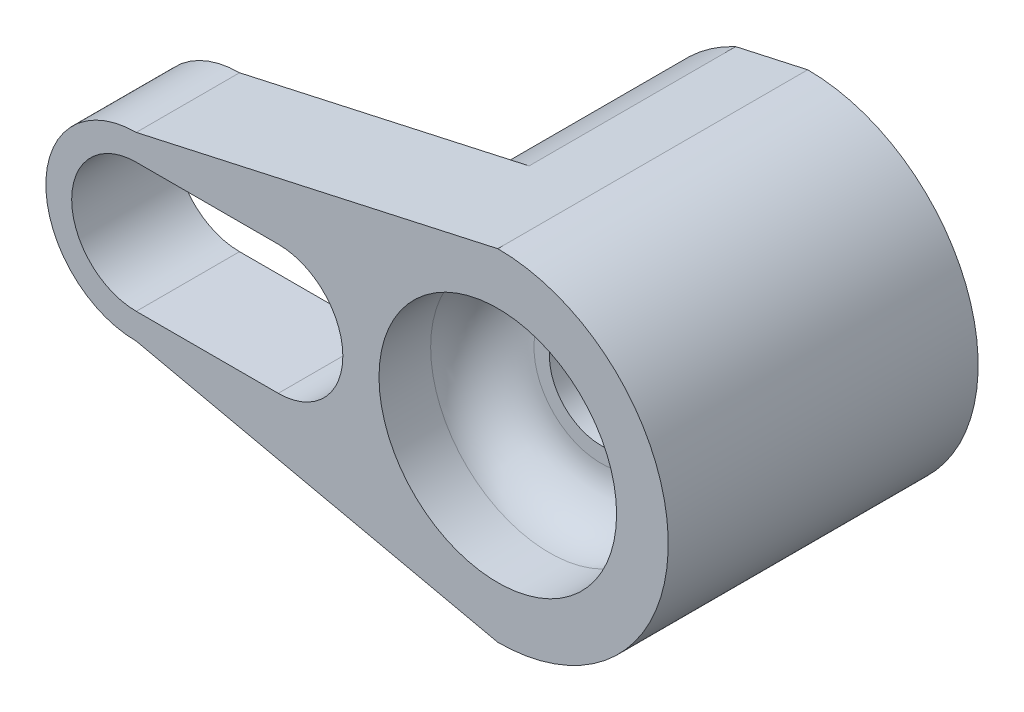
ISO-10303-21;
HEADER;
FILE_DESCRIPTION(('STEP AP214'),'2;1');
FILE_NAME('part.step','',(''),(''),'','','');
FILE_SCHEMA(('AUTOMOTIVE_DESIGN { 1 0 10303 214 1 1 1 1 }'));
ENDSEC;
DATA;
#1=APPLICATION_CONTEXT('core data for automotive mechanical design processes');
#2=APPLICATION_PROTOCOL_DEFINITION('international standard','automotive_design',2000,#1);
#3=PRODUCT_CONTEXT('',#1,'mechanical');
#4=PRODUCT('Part','Part','',(#3));
#5=PRODUCT_RELATED_PRODUCT_CATEGORY('part','',(#4));
#6=PRODUCT_DEFINITION_FORMATION('','',#4);
#7=PRODUCT_DEFINITION_CONTEXT('part definition',#1,'design');
#8=PRODUCT_DEFINITION('design','',#6,#7);
#9=PRODUCT_DEFINITION_SHAPE('','',#8);
#10=(LENGTH_UNIT() NAMED_UNIT(*) SI_UNIT(.MILLI.,.METRE.));
#11=(NAMED_UNIT(*) PLANE_ANGLE_UNIT() SI_UNIT($,.RADIAN.));
#12=(NAMED_UNIT(*) SI_UNIT($,.STERADIAN.) SOLID_ANGLE_UNIT());
#13=UNCERTAINTY_MEASURE_WITH_UNIT(LENGTH_MEASURE(1.E-05),#10,'distance_accuracy_value','');
#14=(GEOMETRIC_REPRESENTATION_CONTEXT(3) GLOBAL_UNCERTAINTY_ASSIGNED_CONTEXT((#13)) GLOBAL_UNIT_ASSIGNED_CONTEXT((#10,
#11,#12)) REPRESENTATION_CONTEXT('',''));
#15=CARTESIAN_POINT('',(0.,0.,0.));
#16=DIRECTION('',(0.,0.,1.));
#17=DIRECTION('',(1.,0.,0.));
#18=AXIS2_PLACEMENT_3D('',#15,#16,#17);
#19=CARTESIAN_POINT('',(0.,0.,2.));
#20=DIRECTION('',(0.,0.,-1.));
#21=DIRECTION('',(-1.,0.,0.));
#22=AXIS2_PLACEMENT_3D('',#19,#20,#21);
#23=CYLINDRICAL_SURFACE('',#22,2.3);
#24=CARTESIAN_POINT('',(0.,0.,-4.));
#25=DIRECTION('',(0.,0.,1.));
#26=DIRECTION('',(1.,0.,0.));
#27=AXIS2_PLACEMENT_3D('',#24,#25,#26);
#28=CIRCLE('',#27,2.3);
#29=CARTESIAN_POINT('',(2.3,0.,-4.));
#30=VERTEX_POINT('',#29);
#31=EDGE_CURVE('E212',#30,#30,#28,.T.);
#32=ORIENTED_EDGE('',*,*,#31,.F.);
#33=EDGE_LOOP('',(#32));
#34=FACE_BOUND('',#33,.T.);
#35=CARTESIAN_POINT('',(0.,0.,-2.));
#36=DIRECTION('',(0.,0.,1.));
#37=DIRECTION('',(1.,0.,0.));
#38=AXIS2_PLACEMENT_3D('',#35,#36,#37);
#39=CIRCLE('',#38,2.3);
#40=CARTESIAN_POINT('',(2.3,0.,-2.));
#41=VERTEX_POINT('',#40);
#42=EDGE_CURVE('E219',#41,#41,#39,.T.);
#43=ORIENTED_EDGE('',*,*,#42,.T.);
#44=EDGE_LOOP('',(#43));
#45=FACE_BOUND('',#44,.T.);
#46=ADVANCED_FACE('F35',(#34,#45),#23,.F.);
#47=CARTESIAN_POINT('',(0.,0.,2.));
#48=DIRECTION('',(0.,0.,-1.));
#49=DIRECTION('',(-1.,0.,0.));
#50=AXIS2_PLACEMENT_3D('',#47,#48,#49);
#51=CYLINDRICAL_SURFACE('',#50,3.3);
#52=DIRECTION('',(0.,0.,-1.));
#53=VECTOR('',#52,1.);
#54=CARTESIAN_POINT('',(0.,-3.3,2.));
#55=LINE('',#54,#53);
#56=CARTESIAN_POINT('',(0.,-3.3,2.));
#57=VERTEX_POINT('',#56);
#58=CARTESIAN_POINT('',(0.,-3.3,-4.));
#59=VERTEX_POINT('',#58);
#60=EDGE_CURVE('E156',#57,#59,#55,.T.);
#61=ORIENTED_EDGE('',*,*,#60,.T.);
#62=CARTESIAN_POINT('',(0.,0.,-4.));
#63=DIRECTION('',(0.,0.,1.));
#64=DIRECTION('',(1.,0.,0.));
#65=AXIS2_PLACEMENT_3D('',#62,#63,#64);
#66=CIRCLE('',#65,3.3);
#67=CARTESIAN_POINT('',(0.,3.3,-4.));
#68=VERTEX_POINT('',#67);
#69=EDGE_CURVE('E274',#59,#68,#66,.T.);
#70=ORIENTED_EDGE('',*,*,#69,.T.);
#71=DIRECTION('',(0.,0.,-1.));
#72=VECTOR('',#71,1.);
#73=CARTESIAN_POINT('',(0.,3.3,2.));
#74=LINE('',#73,#72);
#75=CARTESIAN_POINT('',(0.,3.3,2.));
#76=VERTEX_POINT('',#75);
#77=EDGE_CURVE('E122',#76,#68,#74,.T.);
#78=ORIENTED_EDGE('',*,*,#77,.F.);
#79=CARTESIAN_POINT('',(0.,0.,2.));
#80=DIRECTION('',(0.,0.,1.));
#81=DIRECTION('',(1.,0.,0.));
#82=AXIS2_PLACEMENT_3D('',#79,#80,#81);
#83=CIRCLE('',#82,3.3);
#84=EDGE_CURVE('E131',#57,#76,#83,.T.);
#85=ORIENTED_EDGE('',*,*,#84,.F.);
#86=EDGE_LOOP('',(#61,#70,#78,#85));
#87=FACE_BOUND('',#86,.T.);
#88=ADVANCED_FACE('F273',(#87),#51,.T.);
#89=CARTESIAN_POINT('',(-0.696561451291279,3.14576139292836,2.));
#90=DIRECTION('',(-0.216191979129409,0.976350873487656,0.));
#91=DIRECTION('',(-0.976350873487656,-0.216191979129409,0.));
#92=AXIS2_PLACEMENT_3D('',#89,#90,#91);
#93=PLANE('',#92);
#94=DIRECTION('',(0.976350873487656,0.216191979129409,0.));
#95=VECTOR('',#94,1.);
#96=CARTESIAN_POINT('',(-0.696561451291279,3.14576139292836,0.));
#97=LINE('',#96,#95);
#98=CARTESIAN_POINT('',(-7.,1.75,0.));
#99=VERTEX_POINT('',#98);
#100=CARTESIAN_POINT('',(-1.39312290258256,2.99152278585672,0.));
#101=VERTEX_POINT('',#100);
#102=EDGE_CURVE('E121',#99,#101,#97,.T.);
#103=ORIENTED_EDGE('',*,*,#102,.F.);
#104=DIRECTION('',(0.,0.,-1.));
#105=VECTOR('',#104,1.);
#106=CARTESIAN_POINT('',(-7.,1.75,2.));
#107=LINE('',#106,#105);
#108=CARTESIAN_POINT('',(-7.,1.75,2.));
#109=VERTEX_POINT('',#108);
#110=EDGE_CURVE('E113',#109,#99,#107,.T.);
#111=ORIENTED_EDGE('',*,*,#110,.F.);
#112=DIRECTION('',(0.976350873487656,0.216191979129409,0.));
#113=VECTOR('',#112,1.);
#114=CARTESIAN_POINT('',(-0.696561451291279,3.14576139292836,2.));
#115=LINE('',#114,#113);
#116=EDGE_CURVE('E118',#109,#76,#115,.T.);
#117=ORIENTED_EDGE('',*,*,#116,.T.);
#118=ORIENTED_EDGE('',*,*,#77,.T.);
#119=DIRECTION('',(0.976350873487656,0.216191979129409,0.));
#120=VECTOR('',#119,1.);
#121=CARTESIAN_POINT('',(-0.696561451291279,3.14576139292836,-4.));
#122=LINE('',#121,#120);
#123=CARTESIAN_POINT('',(-1.39312290258256,2.99152278585672,-4.));
#124=VERTEX_POINT('',#123);
#125=EDGE_CURVE('E254',#124,#68,#122,.T.);
#126=ORIENTED_EDGE('',*,*,#125,.F.);
#127=DIRECTION('',(0.,0.,1.));
#128=VECTOR('',#127,1.);
#129=CARTESIAN_POINT('',(-1.39312290258256,2.99152278585672,-4.));
#130=LINE('',#129,#128);
#131=EDGE_CURVE('E244',#124,#101,#130,.T.);
#132=ORIENTED_EDGE('',*,*,#131,.T.);
#133=EDGE_LOOP('',(#103,#111,#117,#118,#126,#132));
#134=FACE_BOUND('',#133,.T.);
#135=ADVANCED_FACE('F115',(#134),#93,.T.);
#136=CARTESIAN_POINT('',(-7.,0.,2.));
#137=DIRECTION('',(0.,0.,-1.));
#138=DIRECTION('',(-1.,0.,0.));
#139=AXIS2_PLACEMENT_3D('',#136,#137,#138);
#140=CYLINDRICAL_SURFACE('',#139,1.75);
#141=CARTESIAN_POINT('',(-7.,0.,0.));
#142=DIRECTION('',(0.,0.,1.));
#143=DIRECTION('',(1.,0.,0.));
#144=AXIS2_PLACEMENT_3D('',#141,#142,#143);
#145=CIRCLE('',#144,1.75);
#146=CARTESIAN_POINT('',(-7.,-1.75,0.));
#147=VERTEX_POINT('',#146);
#148=EDGE_CURVE('E86',#99,#147,#145,.T.);
#149=ORIENTED_EDGE('',*,*,#148,.T.);
#150=DIRECTION('',(0.,0.,-1.));
#151=VECTOR('',#150,1.);
#152=CARTESIAN_POINT('',(-7.,-1.75,2.));
#153=LINE('',#152,#151);
#154=CARTESIAN_POINT('',(-7.,-1.75,2.));
#155=VERTEX_POINT('',#154);
#156=EDGE_CURVE('E123',#155,#147,#153,.T.);
#157=ORIENTED_EDGE('',*,*,#156,.F.);
#158=CARTESIAN_POINT('',(-7.,0.,2.));
#159=DIRECTION('',(0.,0.,1.));
#160=DIRECTION('',(1.,0.,0.));
#161=AXIS2_PLACEMENT_3D('',#158,#159,#160);
#162=CIRCLE('',#161,1.75);
#163=EDGE_CURVE('E125',#109,#155,#162,.T.);
#164=ORIENTED_EDGE('',*,*,#163,.F.);
#165=ORIENTED_EDGE('',*,*,#110,.T.);
#166=EDGE_LOOP('',(#149,#157,#164,#165));
#167=FACE_BOUND('',#166,.T.);
#168=ADVANCED_FACE('F126',(#167),#140,.T.);
#169=CARTESIAN_POINT('',(-4.25,0.,2.));
#170=DIRECTION('',(0.,0.,-1.));
#171=DIRECTION('',(-1.,0.,0.));
#172=AXIS2_PLACEMENT_3D('',#169,#170,#171);
#173=CYLINDRICAL_SURFACE('',#172,1.25);
#174=CARTESIAN_POINT('',(-4.25,0.,0.));
#175=DIRECTION('',(0.,0.,1.));
#176=DIRECTION('',(1.,0.,0.));
#177=AXIS2_PLACEMENT_3D('',#174,#175,#176);
#178=CIRCLE('',#177,1.25);
#179=CARTESIAN_POINT('',(-4.25,-1.25,0.));
#180=VERTEX_POINT('',#179);
#181=CARTESIAN_POINT('',(-3.22235294117647,-0.711647049099023,0.));
#182=VERTEX_POINT('',#181);
#183=EDGE_CURVE('E152',#180,#182,#178,.T.);
#184=ORIENTED_EDGE('',*,*,#183,.F.);
#185=DIRECTION('',(0.,0.,-1.));
#186=VECTOR('',#185,1.);
#187=CARTESIAN_POINT('',(-4.25,-1.25,2.));
#188=LINE('',#187,#186);
#189=CARTESIAN_POINT('',(-4.25,-1.25,2.));
#190=VERTEX_POINT('',#189);
#191=EDGE_CURVE('E94',#190,#180,#188,.T.);
#192=ORIENTED_EDGE('',*,*,#191,.F.);
#193=CARTESIAN_POINT('',(-4.25,0.,2.));
#194=DIRECTION('',(0.,0.,1.));
#195=DIRECTION('',(1.,0.,0.));
#196=AXIS2_PLACEMENT_3D('',#193,#194,#195);
#197=CIRCLE('',#196,1.25);
#198=CARTESIAN_POINT('',(-4.25,1.25,2.));
#199=VERTEX_POINT('',#198);
#200=EDGE_CURVE('E173',#190,#199,#197,.T.);
#201=ORIENTED_EDGE('',*,*,#200,.T.);
#202=DIRECTION('',(0.,0.,-1.));
#203=VECTOR('',#202,1.);
#204=CARTESIAN_POINT('',(-4.25,1.25,2.));
#205=LINE('',#204,#203);
#206=CARTESIAN_POINT('',(-4.25,1.25,0.));
#207=VERTEX_POINT('',#206);
#208=EDGE_CURVE('E142',#199,#207,#205,.T.);
#209=ORIENTED_EDGE('',*,*,#208,.T.);
#210=CARTESIAN_POINT('',(-3.22235294117647,0.711647049099025,0.));
#211=VERTEX_POINT('',#210);
#212=EDGE_CURVE('E149',#211,#207,#178,.T.);
#213=ORIENTED_EDGE('',*,*,#212,.F.);
#214=DIRECTION('',(0.,0.,1.));
#215=VECTOR('',#214,1.);
#216=CARTESIAN_POINT('',(-3.22235294117647,0.711647049099022,-4.));
#217=LINE('',#216,#215);
#218=CARTESIAN_POINT('',(-3.22235294117647,0.711647049099022,-4.));
#219=VERTEX_POINT('',#218);
#220=EDGE_CURVE('E50',#219,#211,#217,.T.);
#221=ORIENTED_EDGE('',*,*,#220,.F.);
#222=CARTESIAN_POINT('',(-4.25,0.,-4.));
#223=DIRECTION('',(0.,0.,1.));
#224=DIRECTION('',(1.,0.,0.));
#225=AXIS2_PLACEMENT_3D('',#222,#223,#224);
#226=CIRCLE('',#225,1.25);
#227=CARTESIAN_POINT('',(-3.22235294117647,-0.711647049099023,-4.));
#228=VERTEX_POINT('',#227);
#229=EDGE_CURVE('E205',#228,#219,#226,.T.);
#230=ORIENTED_EDGE('',*,*,#229,.F.);
#231=DIRECTION('',(0.,0.,1.));
#232=VECTOR('',#231,1.);
#233=CARTESIAN_POINT('',(-3.22235294117647,-0.711647049099023,-4.));
#234=LINE('',#233,#232);
#235=EDGE_CURVE('E201',#228,#182,#234,.T.);
#236=ORIENTED_EDGE('',*,*,#235,.T.);
#237=EDGE_LOOP('',(#184,#192,#201,#209,#213,#221,#230,#236));
#238=FACE_BOUND('',#237,.T.);
#239=ADVANCED_FACE('F198',(#238),#173,.F.);
#240=CARTESIAN_POINT('',(0.,-1.25,2.));
#241=DIRECTION('',(0.,1.,0.));
#242=DIRECTION('',(-1.,0.,0.));
#243=AXIS2_PLACEMENT_3D('',#240,#241,#242);
#244=PLANE('',#243);
#245=DIRECTION('',(1.,0.,0.));
#246=VECTOR('',#245,1.);
#247=CARTESIAN_POINT('',(0.,-1.25,0.));
#248=LINE('',#247,#246);
#249=CARTESIAN_POINT('',(-7.,-1.25,0.));
#250=VERTEX_POINT('',#249);
#251=EDGE_CURVE('E145',#250,#180,#248,.T.);
#252=ORIENTED_EDGE('',*,*,#251,.F.);
#253=DIRECTION('',(0.,0.,-1.));
#254=VECTOR('',#253,1.);
#255=CARTESIAN_POINT('',(-7.,-1.25,2.));
#256=LINE('',#255,#254);
#257=CARTESIAN_POINT('',(-7.,-1.25,2.));
#258=VERTEX_POINT('',#257);
#259=EDGE_CURVE('E157',#258,#250,#256,.T.);
#260=ORIENTED_EDGE('',*,*,#259,.F.);
#261=DIRECTION('',(1.,0.,0.));
#262=VECTOR('',#261,1.);
#263=CARTESIAN_POINT('',(0.,-1.25,2.));
#264=LINE('',#263,#262);
#265=EDGE_CURVE('E196',#258,#190,#264,.T.);
#266=ORIENTED_EDGE('',*,*,#265,.T.);
#267=ORIENTED_EDGE('',*,*,#191,.T.);
#268=EDGE_LOOP('',(#252,#260,#266,#267));
#269=FACE_BOUND('',#268,.T.);
#270=ADVANCED_FACE('F193',(#269),#244,.T.);
#271=CARTESIAN_POINT('',(-7.,0.,2.));
#272=DIRECTION('',(0.,0.,-1.));
#273=DIRECTION('',(-1.,0.,0.));
#274=AXIS2_PLACEMENT_3D('',#271,#272,#273);
#275=CYLINDRICAL_SURFACE('',#274,1.25);
#276=CARTESIAN_POINT('',(-7.,0.,0.));
#277=DIRECTION('',(0.,0.,1.));
#278=DIRECTION('',(1.,0.,0.));
#279=AXIS2_PLACEMENT_3D('',#276,#277,#278);
#280=CIRCLE('',#279,1.25);
#281=CARTESIAN_POINT('',(-7.,1.25,0.));
#282=VERTEX_POINT('',#281);
#283=EDGE_CURVE('E182',#282,#250,#280,.T.);
#284=ORIENTED_EDGE('',*,*,#283,.F.);
#285=DIRECTION('',(0.,0.,-1.));
#286=VECTOR('',#285,1.);
#287=CARTESIAN_POINT('',(-7.,1.25,2.));
#288=LINE('',#287,#286);
#289=CARTESIAN_POINT('',(-7.,1.25,2.));
#290=VERTEX_POINT('',#289);
#291=EDGE_CURVE('E159',#290,#282,#288,.T.);
#292=ORIENTED_EDGE('',*,*,#291,.F.);
#293=CARTESIAN_POINT('',(-7.,0.,2.));
#294=DIRECTION('',(0.,0.,1.));
#295=DIRECTION('',(1.,0.,0.));
#296=AXIS2_PLACEMENT_3D('',#293,#294,#295);
#297=CIRCLE('',#296,1.25);
#298=EDGE_CURVE('E235',#290,#258,#297,.T.);
#299=ORIENTED_EDGE('',*,*,#298,.T.);
#300=ORIENTED_EDGE('',*,*,#259,.T.);
#301=EDGE_LOOP('',(#284,#292,#299,#300));
#302=FACE_BOUND('',#301,.T.);
#303=ADVANCED_FACE('F321',(#302),#275,.F.);
#304=CARTESIAN_POINT('',(-0.696561451291279,-3.14576139292836,2.));
#305=DIRECTION('',(0.216191979129409,0.976350873487656,0.));
#306=DIRECTION('',(-0.976350873487656,0.216191979129409,0.));
#307=AXIS2_PLACEMENT_3D('',#304,#305,#306);
#308=PLANE('',#307);
#309=DIRECTION('',(0.976350873487656,-0.216191979129409,0.));
#310=VECTOR('',#309,1.);
#311=CARTESIAN_POINT('',(-0.696561451291279,-3.14576139292836,0.));
#312=LINE('',#311,#310);
#313=CARTESIAN_POINT('',(-1.39312290258256,-2.99152278585672,0.));
#314=VERTEX_POINT('',#313);
#315=EDGE_CURVE('E170',#147,#314,#312,.T.);
#316=ORIENTED_EDGE('',*,*,#315,.T.);
#317=DIRECTION('',(0.,0.,1.));
#318=VECTOR('',#317,1.);
#319=CARTESIAN_POINT('',(-1.39312290258256,-2.99152278585672,-4.));
#320=LINE('',#319,#318);
#321=CARTESIAN_POINT('',(-1.39312290258256,-2.99152278585672,-4.));
#322=VERTEX_POINT('',#321);
#323=EDGE_CURVE('E211',#322,#314,#320,.T.);
#324=ORIENTED_EDGE('',*,*,#323,.F.);
#325=DIRECTION('',(0.976350873487656,-0.216191979129409,0.));
#326=VECTOR('',#325,1.);
#327=CARTESIAN_POINT('',(-0.696561451291279,-3.14576139292836,-4.));
#328=LINE('',#327,#326);
#329=EDGE_CURVE('E278',#322,#59,#328,.T.);
#330=ORIENTED_EDGE('',*,*,#329,.T.);
#331=ORIENTED_EDGE('',*,*,#60,.F.);
#332=DIRECTION('',(0.976350873487656,-0.216191979129409,0.));
#333=VECTOR('',#332,1.);
#334=CARTESIAN_POINT('',(-0.696561451291279,-3.14576139292836,2.));
#335=LINE('',#334,#333);
#336=EDGE_CURVE('E59',#155,#57,#335,.T.);
#337=ORIENTED_EDGE('',*,*,#336,.F.);
#338=ORIENTED_EDGE('',*,*,#156,.T.);
#339=EDGE_LOOP('',(#316,#324,#330,#331,#337,#338));
#340=FACE_BOUND('',#339,.T.);
#341=ADVANCED_FACE('F258',(#340),#308,.F.);
#342=CARTESIAN_POINT('',(0.,1.25,2.));
#343=DIRECTION('',(0.,1.,0.));
#344=DIRECTION('',(-1.,0.,0.));
#345=AXIS2_PLACEMENT_3D('',#342,#343,#344);
#346=PLANE('',#345);
#347=DIRECTION('',(1.,0.,0.));
#348=VECTOR('',#347,1.);
#349=CARTESIAN_POINT('',(0.,1.25,0.));
#350=LINE('',#349,#348);
#351=EDGE_CURVE('E175',#282,#207,#350,.T.);
#352=ORIENTED_EDGE('',*,*,#351,.T.);
#353=ORIENTED_EDGE('',*,*,#208,.F.);
#354=DIRECTION('',(1.,0.,0.));
#355=VECTOR('',#354,1.);
#356=CARTESIAN_POINT('',(0.,1.25,2.));
#357=LINE('',#356,#355);
#358=EDGE_CURVE('E134',#290,#199,#357,.T.);
#359=ORIENTED_EDGE('',*,*,#358,.F.);
#360=ORIENTED_EDGE('',*,*,#291,.T.);
#361=EDGE_LOOP('',(#352,#353,#359,#360));
#362=FACE_BOUND('',#361,.T.);
#363=ADVANCED_FACE('F242',(#362),#346,.F.);
#364=CARTESIAN_POINT('',(0.,0.,1.));
#365=DIRECTION('',(0.,0.,1.));
#366=DIRECTION('',(1.,0.,0.));
#367=AXIS2_PLACEMENT_3D('',#364,#365,#366);
#368=CIRCLE('',#367,2.3);
#369=CARTESIAN_POINT('',(2.3,0.,1.));
#370=VERTEX_POINT('',#369);
#371=EDGE_CURVE('E11',#370,#370,#368,.F.);
#372=ORIENTED_EDGE('',*,*,#371,.T.);
#373=EDGE_LOOP('',(#372));
#374=FACE_BOUND('',#373,.T.);
#375=CARTESIAN_POINT('',(0.,0.,2.));
#376=DIRECTION('',(0.,0.,1.));
#377=DIRECTION('',(1.,0.,0.));
#378=AXIS2_PLACEMENT_3D('',#375,#376,#377);
#379=CIRCLE('',#378,2.3);
#380=CARTESIAN_POINT('',(2.3,0.,2.));
#381=VERTEX_POINT('',#380);
#382=EDGE_CURVE('E139',#381,#381,#379,.T.);
#383=ORIENTED_EDGE('',*,*,#382,.T.);
#384=EDGE_LOOP('',(#383));
#385=FACE_BOUND('',#384,.T.);
#386=ADVANCED_FACE('F290',(#374,#385),#23,.F.);
#387=CARTESIAN_POINT('',(0.,0.,2.));
#388=DIRECTION('',(0.,0.,1.));
#389=DIRECTION('',(1.,0.,0.));
#390=AXIS2_PLACEMENT_3D('',#387,#388,#389);
#391=PLANE('',#390);
#392=ORIENTED_EDGE('',*,*,#200,.F.);
#393=ORIENTED_EDGE('',*,*,#265,.F.);
#394=ORIENTED_EDGE('',*,*,#298,.F.);
#395=ORIENTED_EDGE('',*,*,#358,.T.);
#396=EDGE_LOOP('',(#392,#393,#394,#395));
#397=FACE_BOUND('',#396,.T.);
#398=ORIENTED_EDGE('',*,*,#84,.T.);
#399=ORIENTED_EDGE('',*,*,#116,.F.);
#400=ORIENTED_EDGE('',*,*,#163,.T.);
#401=ORIENTED_EDGE('',*,*,#336,.T.);
#402=EDGE_LOOP('',(#398,#399,#400,#401));
#403=FACE_BOUND('',#402,.T.);
#404=ORIENTED_EDGE('',*,*,#382,.F.);
#405=EDGE_LOOP('',(#404));
#406=FACE_BOUND('',#405,.T.);
#407=ADVANCED_FACE('F128',(#397,#403,#406),#391,.T.);
#408=CARTESIAN_POINT('',(0.,0.,0.));
#409=DIRECTION('',(0.,0.,1.));
#410=DIRECTION('',(1.,0.,0.));
#411=AXIS2_PLACEMENT_3D('',#408,#409,#410);
#412=PLANE('',#411);
#413=ORIENTED_EDGE('',*,*,#183,.T.);
#414=CARTESIAN_POINT('',(0.,0.,0.));
#415=DIRECTION('',(0.,0.,1.));
#416=DIRECTION('',(1.,0.,0.));
#417=AXIS2_PLACEMENT_3D('',#414,#415,#416);
#418=CIRCLE('',#417,3.3);
#419=EDGE_CURVE('E215',#182,#314,#418,.T.);
#420=ORIENTED_EDGE('',*,*,#419,.T.);
#421=ORIENTED_EDGE('',*,*,#315,.F.);
#422=ORIENTED_EDGE('',*,*,#148,.F.);
#423=ORIENTED_EDGE('',*,*,#102,.T.);
#424=EDGE_CURVE('E176',#101,#211,#418,.T.);
#425=ORIENTED_EDGE('',*,*,#424,.T.);
#426=ORIENTED_EDGE('',*,*,#212,.T.);
#427=ORIENTED_EDGE('',*,*,#351,.F.);
#428=ORIENTED_EDGE('',*,*,#283,.T.);
#429=ORIENTED_EDGE('',*,*,#251,.T.);
#430=EDGE_LOOP('',(#413,#420,#421,#422,#423,#425,#426,#427,#428,#429));
#431=FACE_BOUND('',#430,.T.);
#432=ADVANCED_FACE('F189',(#431),#412,.F.);
#433=CARTESIAN_POINT('',(0.,0.,-4.));
#434=DIRECTION('',(0.,0.,1.));
#435=DIRECTION('',(1.,0.,0.));
#436=AXIS2_PLACEMENT_3D('',#433,#434,#435);
#437=CYLINDRICAL_SURFACE('',#436,3.3);
#438=ORIENTED_EDGE('',*,*,#424,.F.);
#439=ORIENTED_EDGE('',*,*,#131,.F.);
#440=EDGE_CURVE('E281',#124,#219,#66,.T.);
#441=ORIENTED_EDGE('',*,*,#440,.T.);
#442=ORIENTED_EDGE('',*,*,#220,.T.);
#443=EDGE_LOOP('',(#438,#439,#441,#442));
#444=FACE_BOUND('',#443,.T.);
#445=ADVANCED_FACE('F256',(#444),#437,.T.);
#446=ORIENTED_EDGE('',*,*,#419,.F.);
#447=ORIENTED_EDGE('',*,*,#235,.F.);
#448=EDGE_CURVE('E280',#228,#322,#66,.T.);
#449=ORIENTED_EDGE('',*,*,#448,.T.);
#450=ORIENTED_EDGE('',*,*,#323,.T.);
#451=EDGE_LOOP('',(#446,#447,#449,#450));
#452=FACE_BOUND('',#451,.T.);
#453=ADVANCED_FACE('F216',(#452),#437,.T.);
#454=CARTESIAN_POINT('',(0.,0.,-4.));
#455=DIRECTION('',(0.,0.,1.));
#456=DIRECTION('',(1.,0.,0.));
#457=AXIS2_PLACEMENT_3D('',#454,#455,#456);
#458=PLANE('',#457);
#459=ORIENTED_EDGE('',*,*,#229,.T.);
#460=ORIENTED_EDGE('',*,*,#440,.F.);
#461=ORIENTED_EDGE('',*,*,#125,.T.);
#462=ORIENTED_EDGE('',*,*,#69,.F.);
#463=ORIENTED_EDGE('',*,*,#329,.F.);
#464=ORIENTED_EDGE('',*,*,#448,.F.);
#465=EDGE_LOOP('',(#459,#460,#461,#462,#463,#464));
#466=FACE_BOUND('',#465,.T.);
#467=ORIENTED_EDGE('',*,*,#31,.T.);
#468=EDGE_LOOP('',(#467));
#469=FACE_BOUND('',#468,.T.);
#470=ADVANCED_FACE('F276',(#466,#469),#458,.F.);
#471=CARTESIAN_POINT('',(0.,0.,-2.));
#472=DIRECTION('',(0.,0.,1.));
#473=DIRECTION('',(1.,0.,0.));
#474=AXIS2_PLACEMENT_3D('',#471,#472,#473);
#475=CYLINDRICAL_SURFACE('',#474,1.);
#476=CARTESIAN_POINT('',(0.,0.,-2.));
#477=DIRECTION('',(0.,0.,1.));
#478=DIRECTION('',(1.,0.,0.));
#479=AXIS2_PLACEMENT_3D('',#476,#477,#478);
#480=CIRCLE('',#479,1.);
#481=CARTESIAN_POINT('',(1.,0.,-2.));
#482=VERTEX_POINT('',#481);
#483=EDGE_CURVE('E222',#482,#482,#480,.T.);
#484=ORIENTED_EDGE('',*,*,#483,.F.);
#485=EDGE_LOOP('',(#484));
#486=FACE_BOUND('',#485,.T.);
#487=CARTESIAN_POINT('',(0.,0.,0.));
#488=DIRECTION('',(0.,0.,1.));
#489=DIRECTION('',(1.,0.,0.));
#490=AXIS2_PLACEMENT_3D('',#487,#488,#489);
#491=CIRCLE('',#490,1.);
#492=CARTESIAN_POINT('',(1.,0.,0.));
#493=VERTEX_POINT('',#492);
#494=EDGE_CURVE('E419',#493,#493,#491,.T.);
#495=ORIENTED_EDGE('',*,*,#494,.T.);
#496=EDGE_LOOP('',(#495));
#497=FACE_BOUND('',#496,.T.);
#498=ADVANCED_FACE('F296',(#486,#497),#475,.F.);
#499=CARTESIAN_POINT('',(0.,0.,-2.));
#500=DIRECTION('',(0.,0.,1.));
#501=DIRECTION('',(1.,0.,0.));
#502=AXIS2_PLACEMENT_3D('',#499,#500,#501);
#503=PLANE('',#502);
#504=ORIENTED_EDGE('',*,*,#483,.T.);
#505=EDGE_LOOP('',(#504));
#506=FACE_BOUND('',#505,.T.);
#507=ORIENTED_EDGE('',*,*,#42,.F.);
#508=EDGE_LOOP('',(#507));
#509=FACE_BOUND('',#508,.T.);
#510=ADVANCED_FACE('F293',(#506,#509),#503,.F.);
#511=CARTESIAN_POINT('',(0.,0.,0.));
#512=DIRECTION('',(0.,0.,1.));
#513=DIRECTION('',(1.,0.,0.));
#514=AXIS2_PLACEMENT_3D('',#511,#512,#513);
#515=PLANE('',#514);
#516=CARTESIAN_POINT('',(0.,0.,0.));
#517=DIRECTION('',(0.,0.,1.));
#518=DIRECTION('',(1.,0.,0.));
#519=AXIS2_PLACEMENT_3D('',#516,#517,#518);
#520=CIRCLE('',#519,1.3);
#521=CARTESIAN_POINT('',(1.3,0.,0.));
#522=VERTEX_POINT('',#521);
#523=EDGE_CURVE('E43',#522,#522,#520,.T.);
#524=ORIENTED_EDGE('',*,*,#523,.T.);
#525=EDGE_LOOP('',(#524));
#526=FACE_BOUND('',#525,.T.);
#527=ORIENTED_EDGE('',*,*,#494,.F.);
#528=EDGE_LOOP('',(#527));
#529=FACE_BOUND('',#528,.T.);
#530=ADVANCED_FACE('F295',(#526,#529),#515,.T.);
#531=CARTESIAN_POINT('',(0.,0.,1.));
#532=DIRECTION('',(0.,0.,1.));
#533=DIRECTION('',(1.,0.,0.));
#534=AXIS2_PLACEMENT_3D('',#531,#532,#533);
#535=TOROIDAL_SURFACE('',#534,1.3,1.);
#536=ORIENTED_EDGE('',*,*,#371,.F.);
#537=EDGE_LOOP('',(#536));
#538=FACE_BOUND('',#537,.T.);
#539=ORIENTED_EDGE('',*,*,#523,.F.);
#540=EDGE_LOOP('',(#539));
#541=FACE_BOUND('',#540,.T.);
#542=ADVANCED_FACE('F37',(#538,#541),#535,.F.);
#543=CLOSED_SHELL('',(#46,#88,#135,#168,#239,#270,#303,#341,#363,#386,#407,#432,#445,#453,#470,
#498,#510,#530,#542));
#544=MANIFOLD_SOLID_BREP('B2',#543);
#545=ADVANCED_BREP_SHAPE_REPRESENTATION('',(#18,#544),#14);
#546=SHAPE_DEFINITION_REPRESENTATION(#9,#545);
ENDSEC;
END-ISO-10303-21;
